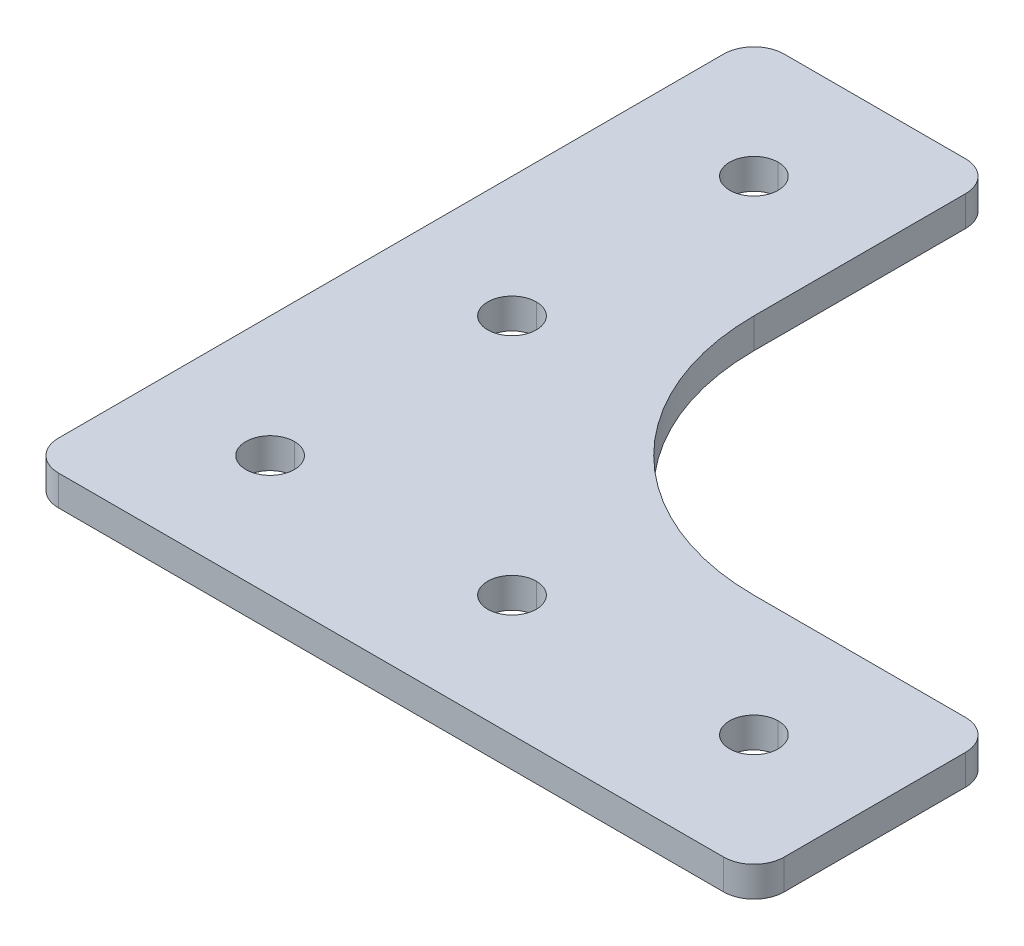
ISO-10303-21;
HEADER;
FILE_DESCRIPTION(('STEP AP214'),'2;1');
FILE_NAME('part.step','',(''),(''),'','','');
FILE_SCHEMA(('AUTOMOTIVE_DESIGN { 1 0 10303 214 1 1 1 1 }'));
ENDSEC;
DATA;
#1=APPLICATION_CONTEXT('core data for automotive mechanical design processes');
#2=APPLICATION_PROTOCOL_DEFINITION('international standard','automotive_design',2000,#1);
#3=PRODUCT_CONTEXT('',#1,'mechanical');
#4=PRODUCT('Part','Part','',(#3));
#5=PRODUCT_RELATED_PRODUCT_CATEGORY('part','',(#4));
#6=PRODUCT_DEFINITION_FORMATION('','',#4);
#7=PRODUCT_DEFINITION_CONTEXT('part definition',#1,'design');
#8=PRODUCT_DEFINITION('design','',#6,#7);
#9=PRODUCT_DEFINITION_SHAPE('','',#8);
#10=(LENGTH_UNIT() NAMED_UNIT(*) SI_UNIT(.MILLI.,.METRE.));
#11=(NAMED_UNIT(*) PLANE_ANGLE_UNIT() SI_UNIT($,.RADIAN.));
#12=(NAMED_UNIT(*) SI_UNIT($,.STERADIAN.) SOLID_ANGLE_UNIT());
#13=UNCERTAINTY_MEASURE_WITH_UNIT(LENGTH_MEASURE(1.E-05),#10,'distance_accuracy_value','');
#14=(GEOMETRIC_REPRESENTATION_CONTEXT(3) GLOBAL_UNCERTAINTY_ASSIGNED_CONTEXT((#13)) GLOBAL_UNIT_ASSIGNED_CONTEXT((#10,
#11,#12)) REPRESENTATION_CONTEXT('',''));
#15=CARTESIAN_POINT('',(0.,0.,0.));
#16=DIRECTION('',(0.,0.,1.));
#17=DIRECTION('',(1.,0.,0.));
#18=AXIS2_PLACEMENT_3D('',#15,#16,#17);
#19=CARTESIAN_POINT('',(3.175,3.175,-73.025));
#20=DIRECTION('',(0.,-1.,0.));
#21=DIRECTION('',(0.,0.,-1.));
#22=AXIS2_PLACEMENT_3D('',#19,#20,#21);
#23=CYLINDRICAL_SURFACE('',#22,3.175);
#24=CARTESIAN_POINT('',(3.175,3.175,-73.025));
#25=DIRECTION('',(0.,1.,0.));
#26=DIRECTION('',(0.,0.,-1.));
#27=AXIS2_PLACEMENT_3D('',#24,#25,#26);
#28=CIRCLE('',#27,3.175);
#29=CARTESIAN_POINT('',(3.175,3.175,-76.2));
#30=VERTEX_POINT('',#29);
#31=CARTESIAN_POINT('',(0.,3.175,-73.025));
#32=VERTEX_POINT('',#31);
#33=EDGE_CURVE('E410',#30,#32,#28,.T.);
#34=ORIENTED_EDGE('',*,*,#33,.F.);
#35=DIRECTION('',(0.,1.,0.));
#36=VECTOR('',#35,1.);
#37=CARTESIAN_POINT('',(3.175,3.175,-76.2));
#38=LINE('',#37,#36);
#39=CARTESIAN_POINT('',(3.175,0.,-76.2));
#40=VERTEX_POINT('',#39);
#41=EDGE_CURVE('E272',#40,#30,#38,.T.);
#42=ORIENTED_EDGE('',*,*,#41,.F.);
#43=CARTESIAN_POINT('',(3.175,0.,-73.025));
#44=DIRECTION('',(0.,-1.,0.));
#45=DIRECTION('',(0.,0.,-1.));
#46=AXIS2_PLACEMENT_3D('',#43,#44,#45);
#47=CIRCLE('',#46,3.175);
#48=CARTESIAN_POINT('',(0.,0.,-73.025));
#49=VERTEX_POINT('',#48);
#50=EDGE_CURVE('E42',#49,#40,#47,.T.);
#51=ORIENTED_EDGE('',*,*,#50,.F.);
#52=DIRECTION('',(0.,-1.,0.));
#53=VECTOR('',#52,1.);
#54=CARTESIAN_POINT('',(0.,3.175,-73.025));
#55=LINE('',#54,#53);
#56=EDGE_CURVE('E262',#32,#49,#55,.T.);
#57=ORIENTED_EDGE('',*,*,#56,.F.);
#58=EDGE_LOOP('',(#34,#42,#51,#57));
#59=FACE_BOUND('',#58,.T.);
#60=ADVANCED_FACE('F16',(#59),#23,.T.);
#61=CARTESIAN_POINT('',(22.225,3.175,-73.025));
#62=DIRECTION('',(0.,-1.,0.));
#63=DIRECTION('',(0.,0.,-1.));
#64=AXIS2_PLACEMENT_3D('',#61,#62,#63);
#65=CYLINDRICAL_SURFACE('',#64,3.175);
#66=CARTESIAN_POINT('',(22.225,3.175,-73.025));
#67=DIRECTION('',(0.,1.,0.));
#68=DIRECTION('',(0.,0.,-1.));
#69=AXIS2_PLACEMENT_3D('',#66,#67,#68);
#70=CIRCLE('',#69,3.175);
#71=CARTESIAN_POINT('',(25.4,3.175,-73.025));
#72=VERTEX_POINT('',#71);
#73=CARTESIAN_POINT('',(22.225,3.175,-76.2));
#74=VERTEX_POINT('',#73);
#75=EDGE_CURVE('E176',#72,#74,#70,.T.);
#76=ORIENTED_EDGE('',*,*,#75,.F.);
#77=DIRECTION('',(0.,1.,0.));
#78=VECTOR('',#77,1.);
#79=CARTESIAN_POINT('',(25.4,3.175,-73.025));
#80=LINE('',#79,#78);
#81=CARTESIAN_POINT('',(25.4,0.,-73.025));
#82=VERTEX_POINT('',#81);
#83=EDGE_CURVE('E351',#82,#72,#80,.T.);
#84=ORIENTED_EDGE('',*,*,#83,.F.);
#85=CARTESIAN_POINT('',(22.225,0.,-73.025));
#86=DIRECTION('',(0.,-1.,0.));
#87=DIRECTION('',(0.,0.,-1.));
#88=AXIS2_PLACEMENT_3D('',#85,#86,#87);
#89=CIRCLE('',#88,3.175);
#90=CARTESIAN_POINT('',(22.225,0.,-76.2));
#91=VERTEX_POINT('',#90);
#92=EDGE_CURVE('E359',#91,#82,#89,.T.);
#93=ORIENTED_EDGE('',*,*,#92,.F.);
#94=DIRECTION('',(0.,-1.,0.));
#95=VECTOR('',#94,1.);
#96=CARTESIAN_POINT('',(22.225,3.175,-76.2));
#97=LINE('',#96,#95);
#98=EDGE_CURVE('E273',#74,#91,#97,.T.);
#99=ORIENTED_EDGE('',*,*,#98,.F.);
#100=EDGE_LOOP('',(#76,#84,#93,#99));
#101=FACE_BOUND('',#100,.T.);
#102=ADVANCED_FACE('F507',(#101),#65,.T.);
#103=CARTESIAN_POINT('',(3.175,3.175,-3.175));
#104=DIRECTION('',(0.,-1.,0.));
#105=DIRECTION('',(0.,0.,-1.));
#106=AXIS2_PLACEMENT_3D('',#103,#104,#105);
#107=CYLINDRICAL_SURFACE('',#106,3.175);
#108=CARTESIAN_POINT('',(3.175,3.175,-3.175));
#109=DIRECTION('',(0.,1.,0.));
#110=DIRECTION('',(0.,0.,-1.));
#111=AXIS2_PLACEMENT_3D('',#108,#109,#110);
#112=CIRCLE('',#111,3.175);
#113=CARTESIAN_POINT('',(0.,3.175,-3.175));
#114=VERTEX_POINT('',#113);
#115=CARTESIAN_POINT('',(3.175,3.175,0.));
#116=VERTEX_POINT('',#115);
#117=EDGE_CURVE('E241',#114,#116,#112,.T.);
#118=ORIENTED_EDGE('',*,*,#117,.F.);
#119=DIRECTION('',(0.,1.,0.));
#120=VECTOR('',#119,1.);
#121=CARTESIAN_POINT('',(0.,3.175,-3.175));
#122=LINE('',#121,#120);
#123=CARTESIAN_POINT('',(0.,0.,-3.175));
#124=VERTEX_POINT('',#123);
#125=EDGE_CURVE('E295',#124,#114,#122,.T.);
#126=ORIENTED_EDGE('',*,*,#125,.F.);
#127=CARTESIAN_POINT('',(3.175,0.,-3.175));
#128=DIRECTION('',(0.,-1.,0.));
#129=DIRECTION('',(0.,0.,-1.));
#130=AXIS2_PLACEMENT_3D('',#127,#128,#129);
#131=CIRCLE('',#130,3.175);
#132=CARTESIAN_POINT('',(3.175,0.,0.));
#133=VERTEX_POINT('',#132);
#134=EDGE_CURVE('E415',#133,#124,#131,.T.);
#135=ORIENTED_EDGE('',*,*,#134,.F.);
#136=DIRECTION('',(0.,-1.,0.));
#137=VECTOR('',#136,1.);
#138=CARTESIAN_POINT('',(3.175,3.175,0.));
#139=LINE('',#138,#137);
#140=EDGE_CURVE('E251',#116,#133,#139,.T.);
#141=ORIENTED_EDGE('',*,*,#140,.F.);
#142=EDGE_LOOP('',(#118,#126,#135,#141));
#143=FACE_BOUND('',#142,.T.);
#144=ADVANCED_FACE('F513',(#143),#107,.T.);
#145=CARTESIAN_POINT('',(73.025,3.175,-3.175));
#146=DIRECTION('',(0.,-1.,0.));
#147=DIRECTION('',(0.,0.,-1.));
#148=AXIS2_PLACEMENT_3D('',#145,#146,#147);
#149=CYLINDRICAL_SURFACE('',#148,3.175);
#150=CARTESIAN_POINT('',(73.025,3.175,-3.175));
#151=DIRECTION('',(0.,1.,0.));
#152=DIRECTION('',(0.,0.,-1.));
#153=AXIS2_PLACEMENT_3D('',#150,#151,#152);
#154=CIRCLE('',#153,3.175);
#155=CARTESIAN_POINT('',(73.025,3.175,0.));
#156=VERTEX_POINT('',#155);
#157=CARTESIAN_POINT('',(76.2,3.175,-3.175));
#158=VERTEX_POINT('',#157);
#159=EDGE_CURVE('E147',#156,#158,#154,.T.);
#160=ORIENTED_EDGE('',*,*,#159,.F.);
#161=DIRECTION('',(0.,1.,0.));
#162=VECTOR('',#161,1.);
#163=CARTESIAN_POINT('',(73.025,3.175,0.));
#164=LINE('',#163,#162);
#165=CARTESIAN_POINT('',(73.025,0.,0.));
#166=VERTEX_POINT('',#165);
#167=EDGE_CURVE('E234',#166,#156,#164,.T.);
#168=ORIENTED_EDGE('',*,*,#167,.F.);
#169=CARTESIAN_POINT('',(73.025,0.,-3.175));
#170=DIRECTION('',(0.,-1.,0.));
#171=DIRECTION('',(0.,0.,-1.));
#172=AXIS2_PLACEMENT_3D('',#169,#170,#171);
#173=CIRCLE('',#172,3.175);
#174=CARTESIAN_POINT('',(76.2,0.,-3.175));
#175=VERTEX_POINT('',#174);
#176=EDGE_CURVE('E371',#175,#166,#173,.T.);
#177=ORIENTED_EDGE('',*,*,#176,.F.);
#178=DIRECTION('',(0.,-1.,0.));
#179=VECTOR('',#178,1.);
#180=CARTESIAN_POINT('',(76.2,3.175,-3.175));
#181=LINE('',#180,#179);
#182=EDGE_CURVE('E237',#158,#175,#181,.T.);
#183=ORIENTED_EDGE('',*,*,#182,.F.);
#184=EDGE_LOOP('',(#160,#168,#177,#183));
#185=FACE_BOUND('',#184,.T.);
#186=ADVANCED_FACE('F232',(#185),#149,.T.);
#187=CARTESIAN_POINT('',(73.025,3.175,-22.225));
#188=DIRECTION('',(0.,-1.,0.));
#189=DIRECTION('',(0.,0.,-1.));
#190=AXIS2_PLACEMENT_3D('',#187,#188,#189);
#191=CYLINDRICAL_SURFACE('',#190,3.175);
#192=CARTESIAN_POINT('',(73.025,3.175,-22.225));
#193=DIRECTION('',(0.,1.,0.));
#194=DIRECTION('',(0.,0.,-1.));
#195=AXIS2_PLACEMENT_3D('',#192,#193,#194);
#196=CIRCLE('',#195,3.175);
#197=CARTESIAN_POINT('',(76.2,3.175,-22.225));
#198=VERTEX_POINT('',#197);
#199=CARTESIAN_POINT('',(73.025,3.175,-25.4));
#200=VERTEX_POINT('',#199);
#201=EDGE_CURVE('E159',#198,#200,#196,.T.);
#202=ORIENTED_EDGE('',*,*,#201,.F.);
#203=DIRECTION('',(0.,1.,0.));
#204=VECTOR('',#203,1.);
#205=CARTESIAN_POINT('',(76.2,3.175,-22.225));
#206=LINE('',#205,#204);
#207=CARTESIAN_POINT('',(76.2,0.,-22.225));
#208=VERTEX_POINT('',#207);
#209=EDGE_CURVE('E316',#208,#198,#206,.T.);
#210=ORIENTED_EDGE('',*,*,#209,.F.);
#211=CARTESIAN_POINT('',(73.025,0.,-22.225));
#212=DIRECTION('',(0.,-1.,0.));
#213=DIRECTION('',(0.,0.,-1.));
#214=AXIS2_PLACEMENT_3D('',#211,#212,#213);
#215=CIRCLE('',#214,3.175);
#216=CARTESIAN_POINT('',(73.025,0.,-25.4));
#217=VERTEX_POINT('',#216);
#218=EDGE_CURVE('E368',#217,#208,#215,.T.);
#219=ORIENTED_EDGE('',*,*,#218,.F.);
#220=DIRECTION('',(0.,-1.,0.));
#221=VECTOR('',#220,1.);
#222=CARTESIAN_POINT('',(73.025,3.175,-25.4));
#223=LINE('',#222,#221);
#224=EDGE_CURVE('E278',#200,#217,#223,.T.);
#225=ORIENTED_EDGE('',*,*,#224,.F.);
#226=EDGE_LOOP('',(#202,#210,#219,#225));
#227=FACE_BOUND('',#226,.T.);
#228=ADVANCED_FACE('F540',(#227),#191,.T.);
#229=CARTESIAN_POINT('',(12.7,0.,-63.5));
#230=DIRECTION('',(0.,1.,0.));
#231=DIRECTION('',(0.,0.,1.));
#232=AXIS2_PLACEMENT_3D('',#229,#230,#231);
#233=CYLINDRICAL_SURFACE('',#232,2.5527);
#234=DIRECTION('',(0.,1.,0.));
#235=VECTOR('',#234,1.);
#236=CARTESIAN_POINT('',(12.7,0.,-66.0527));
#237=LINE('',#236,#235);
#238=CARTESIAN_POINT('',(12.7,0.,-66.0527));
#239=VERTEX_POINT('',#238);
#240=CARTESIAN_POINT('',(12.7,3.175,-66.0527));
#241=VERTEX_POINT('',#240);
#242=EDGE_CURVE('E310',#239,#241,#237,.T.);
#243=ORIENTED_EDGE('',*,*,#242,.F.);
#244=CARTESIAN_POINT('',(12.7,0.,-63.5));
#245=DIRECTION('',(0.,1.,0.));
#246=DIRECTION('',(0.,0.,1.));
#247=AXIS2_PLACEMENT_3D('',#244,#245,#246);
#248=CIRCLE('',#247,2.5527);
#249=CARTESIAN_POINT('',(12.7,0.,-60.9473));
#250=VERTEX_POINT('',#249);
#251=EDGE_CURVE('E20',#250,#239,#248,.T.);
#252=ORIENTED_EDGE('',*,*,#251,.F.);
#253=DIRECTION('',(0.,1.,0.));
#254=VECTOR('',#253,1.);
#255=CARTESIAN_POINT('',(12.7,0.,-60.9473));
#256=LINE('',#255,#254);
#257=CARTESIAN_POINT('',(12.7,3.175,-60.9473));
#258=VERTEX_POINT('',#257);
#259=EDGE_CURVE('E320',#250,#258,#256,.T.);
#260=ORIENTED_EDGE('',*,*,#259,.T.);
#261=CARTESIAN_POINT('',(12.7,3.175,-63.5));
#262=DIRECTION('',(0.,1.,0.));
#263=DIRECTION('',(0.,0.,1.));
#264=AXIS2_PLACEMENT_3D('',#261,#262,#263);
#265=CIRCLE('',#264,2.5527);
#266=EDGE_CURVE('E240',#258,#241,#265,.T.);
#267=ORIENTED_EDGE('',*,*,#266,.T.);
#268=EDGE_LOOP('',(#243,#252,#260,#267));
#269=FACE_BOUND('',#268,.T.);
#270=ADVANCED_FACE('F483',(#269),#233,.F.);
#271=CARTESIAN_POINT('',(12.7,0.,-38.1));
#272=DIRECTION('',(0.,1.,0.));
#273=DIRECTION('',(0.,0.,1.));
#274=AXIS2_PLACEMENT_3D('',#271,#272,#273);
#275=CYLINDRICAL_SURFACE('',#274,2.5527);
#276=DIRECTION('',(0.,1.,0.));
#277=VECTOR('',#276,1.);
#278=CARTESIAN_POINT('',(12.7,0.,-40.6527));
#279=LINE('',#278,#277);
#280=CARTESIAN_POINT('',(12.7,0.,-40.6527));
#281=VERTEX_POINT('',#280);
#282=CARTESIAN_POINT('',(12.7,3.175,-40.6527));
#283=VERTEX_POINT('',#282);
#284=EDGE_CURVE('E296',#281,#283,#279,.T.);
#285=ORIENTED_EDGE('',*,*,#284,.F.);
#286=CARTESIAN_POINT('',(12.7,0.,-38.1));
#287=DIRECTION('',(0.,1.,0.));
#288=DIRECTION('',(0.,0.,1.));
#289=AXIS2_PLACEMENT_3D('',#286,#287,#288);
#290=CIRCLE('',#289,2.5527);
#291=CARTESIAN_POINT('',(12.7,0.,-35.5473));
#292=VERTEX_POINT('',#291);
#293=EDGE_CURVE('E305',#292,#281,#290,.T.);
#294=ORIENTED_EDGE('',*,*,#293,.F.);
#295=DIRECTION('',(0.,1.,0.));
#296=VECTOR('',#295,1.);
#297=CARTESIAN_POINT('',(12.7,0.,-35.5473));
#298=LINE('',#297,#296);
#299=CARTESIAN_POINT('',(12.7,3.175,-35.5473));
#300=VERTEX_POINT('',#299);
#301=EDGE_CURVE('E338',#292,#300,#298,.T.);
#302=ORIENTED_EDGE('',*,*,#301,.T.);
#303=CARTESIAN_POINT('',(12.7,3.175,-38.1));
#304=DIRECTION('',(0.,1.,0.));
#305=DIRECTION('',(0.,0.,1.));
#306=AXIS2_PLACEMENT_3D('',#303,#304,#305);
#307=CIRCLE('',#306,2.5527);
#308=EDGE_CURVE('E427',#300,#283,#307,.T.);
#309=ORIENTED_EDGE('',*,*,#308,.T.);
#310=EDGE_LOOP('',(#285,#294,#302,#309));
#311=FACE_BOUND('',#310,.T.);
#312=ADVANCED_FACE('F566',(#311),#275,.F.);
#313=CARTESIAN_POINT('',(12.7,0.,-12.7));
#314=DIRECTION('',(0.,1.,0.));
#315=DIRECTION('',(0.,0.,1.));
#316=AXIS2_PLACEMENT_3D('',#313,#314,#315);
#317=CYLINDRICAL_SURFACE('',#316,2.5527);
#318=DIRECTION('',(0.,1.,0.));
#319=VECTOR('',#318,1.);
#320=CARTESIAN_POINT('',(12.7,0.,-15.2527));
#321=LINE('',#320,#319);
#322=CARTESIAN_POINT('',(12.7,0.,-15.2527));
#323=VERTEX_POINT('',#322);
#324=CARTESIAN_POINT('',(12.7,3.175,-15.2527));
#325=VERTEX_POINT('',#324);
#326=EDGE_CURVE('E437',#323,#325,#321,.T.);
#327=ORIENTED_EDGE('',*,*,#326,.F.);
#328=CARTESIAN_POINT('',(12.7,0.,-12.7));
#329=DIRECTION('',(0.,1.,0.));
#330=DIRECTION('',(0.,0.,1.));
#331=AXIS2_PLACEMENT_3D('',#328,#329,#330);
#332=CIRCLE('',#331,2.5527);
#333=CARTESIAN_POINT('',(12.7,0.,-10.1473));
#334=VERTEX_POINT('',#333);
#335=EDGE_CURVE('E302',#334,#323,#332,.T.);
#336=ORIENTED_EDGE('',*,*,#335,.F.);
#337=DIRECTION('',(0.,1.,0.));
#338=VECTOR('',#337,1.);
#339=CARTESIAN_POINT('',(12.7,0.,-10.1473));
#340=LINE('',#339,#338);
#341=CARTESIAN_POINT('',(12.7,3.175,-10.1473));
#342=VERTEX_POINT('',#341);
#343=EDGE_CURVE('E279',#334,#342,#340,.T.);
#344=ORIENTED_EDGE('',*,*,#343,.T.);
#345=CARTESIAN_POINT('',(12.7,3.175,-12.7));
#346=DIRECTION('',(0.,1.,0.));
#347=DIRECTION('',(0.,0.,1.));
#348=AXIS2_PLACEMENT_3D('',#345,#346,#347);
#349=CIRCLE('',#348,2.5527);
#350=EDGE_CURVE('E376',#342,#325,#349,.T.);
#351=ORIENTED_EDGE('',*,*,#350,.T.);
#352=EDGE_LOOP('',(#327,#336,#344,#351));
#353=FACE_BOUND('',#352,.T.);
#354=ADVANCED_FACE('F570',(#353),#317,.F.);
#355=CARTESIAN_POINT('',(38.1,0.,-12.7));
#356=DIRECTION('',(0.,1.,0.));
#357=DIRECTION('',(0.,0.,1.));
#358=AXIS2_PLACEMENT_3D('',#355,#356,#357);
#359=CYLINDRICAL_SURFACE('',#358,2.5527);
#360=DIRECTION('',(0.,1.,0.));
#361=VECTOR('',#360,1.);
#362=CARTESIAN_POINT('',(38.1,0.,-15.2527));
#363=LINE('',#362,#361);
#364=CARTESIAN_POINT('',(38.1,0.,-15.2527));
#365=VERTEX_POINT('',#364);
#366=CARTESIAN_POINT('',(38.1,3.175,-15.2527));
#367=VERTEX_POINT('',#366);
#368=EDGE_CURVE('E339',#365,#367,#363,.T.);
#369=ORIENTED_EDGE('',*,*,#368,.F.);
#370=CARTESIAN_POINT('',(38.1,0.,-12.7));
#371=DIRECTION('',(0.,1.,0.));
#372=DIRECTION('',(0.,0.,1.));
#373=AXIS2_PLACEMENT_3D('',#370,#371,#372);
#374=CIRCLE('',#373,2.5527);
#375=CARTESIAN_POINT('',(38.1,0.,-10.1473));
#376=VERTEX_POINT('',#375);
#377=EDGE_CURVE('E27',#376,#365,#374,.T.);
#378=ORIENTED_EDGE('',*,*,#377,.F.);
#379=DIRECTION('',(0.,1.,0.));
#380=VECTOR('',#379,1.);
#381=CARTESIAN_POINT('',(38.1,0.,-10.1473));
#382=LINE('',#381,#380);
#383=CARTESIAN_POINT('',(38.1,3.175,-10.1473));
#384=VERTEX_POINT('',#383);
#385=EDGE_CURVE('E377',#376,#384,#382,.T.);
#386=ORIENTED_EDGE('',*,*,#385,.T.);
#387=CARTESIAN_POINT('',(38.1,3.175,-12.7));
#388=DIRECTION('',(0.,1.,0.));
#389=DIRECTION('',(0.,0.,1.));
#390=AXIS2_PLACEMENT_3D('',#387,#388,#389);
#391=CIRCLE('',#390,2.5527);
#392=EDGE_CURVE('E373',#384,#367,#391,.T.);
#393=ORIENTED_EDGE('',*,*,#392,.T.);
#394=EDGE_LOOP('',(#369,#378,#386,#393));
#395=FACE_BOUND('',#394,.T.);
#396=ADVANCED_FACE('F576',(#395),#359,.F.);
#397=CARTESIAN_POINT('',(63.5,0.,-12.7));
#398=DIRECTION('',(0.,1.,0.));
#399=DIRECTION('',(0.,0.,1.));
#400=AXIS2_PLACEMENT_3D('',#397,#398,#399);
#401=CYLINDRICAL_SURFACE('',#400,2.5527);
#402=DIRECTION('',(0.,1.,0.));
#403=VECTOR('',#402,1.);
#404=CARTESIAN_POINT('',(63.5,0.,-15.2527));
#405=LINE('',#404,#403);
#406=CARTESIAN_POINT('',(63.5,0.,-15.2527));
#407=VERTEX_POINT('',#406);
#408=CARTESIAN_POINT('',(63.5,3.175,-15.2527));
#409=VERTEX_POINT('',#408);
#410=EDGE_CURVE('E290',#407,#409,#405,.T.);
#411=ORIENTED_EDGE('',*,*,#410,.F.);
#412=CARTESIAN_POINT('',(63.5,0.,-12.7));
#413=DIRECTION('',(0.,1.,0.));
#414=DIRECTION('',(0.,0.,1.));
#415=AXIS2_PLACEMENT_3D('',#412,#413,#414);
#416=CIRCLE('',#415,2.5527);
#417=CARTESIAN_POINT('',(63.5,0.,-10.1473));
#418=VERTEX_POINT('',#417);
#419=EDGE_CURVE('E10',#418,#407,#416,.T.);
#420=ORIENTED_EDGE('',*,*,#419,.F.);
#421=DIRECTION('',(0.,1.,0.));
#422=VECTOR('',#421,1.);
#423=CARTESIAN_POINT('',(63.5,0.,-10.1473));
#424=LINE('',#423,#422);
#425=CARTESIAN_POINT('',(63.5,3.175,-10.1473));
#426=VERTEX_POINT('',#425);
#427=EDGE_CURVE('E289',#418,#426,#424,.T.);
#428=ORIENTED_EDGE('',*,*,#427,.T.);
#429=CARTESIAN_POINT('',(63.5,3.175,-12.7));
#430=DIRECTION('',(0.,1.,0.));
#431=DIRECTION('',(0.,0.,1.));
#432=AXIS2_PLACEMENT_3D('',#429,#430,#431);
#433=CIRCLE('',#432,2.5527);
#434=EDGE_CURVE('E372',#426,#409,#433,.T.);
#435=ORIENTED_EDGE('',*,*,#434,.T.);
#436=EDGE_LOOP('',(#411,#420,#428,#435));
#437=FACE_BOUND('',#436,.T.);
#438=ADVANCED_FACE('F501',(#437),#401,.F.);
#439=CARTESIAN_POINT('',(50.8,0.,-50.8));
#440=DIRECTION('',(0.,-1.,0.));
#441=DIRECTION('',(0.,0.,-1.));
#442=AXIS2_PLACEMENT_3D('',#439,#440,#441);
#443=PLANE('',#442);
#444=ORIENTED_EDGE('',*,*,#419,.T.);
#445=CARTESIAN_POINT('',(63.5,0.,-12.7));
#446=DIRECTION('',(0.,1.,0.));
#447=DIRECTION('',(0.,0.,1.));
#448=AXIS2_PLACEMENT_3D('',#445,#446,#447);
#449=CIRCLE('',#448,2.5527);
#450=EDGE_CURVE('E346',#407,#418,#449,.T.);
#451=ORIENTED_EDGE('',*,*,#450,.T.);
#452=EDGE_LOOP('',(#444,#451));
#453=FACE_BOUND('',#452,.T.);
#454=ORIENTED_EDGE('',*,*,#377,.T.);
#455=CARTESIAN_POINT('',(38.1,0.,-12.7));
#456=DIRECTION('',(0.,1.,0.));
#457=DIRECTION('',(0.,0.,1.));
#458=AXIS2_PLACEMENT_3D('',#455,#456,#457);
#459=CIRCLE('',#458,2.5527);
#460=EDGE_CURVE('E283',#365,#376,#459,.T.);
#461=ORIENTED_EDGE('',*,*,#460,.T.);
#462=EDGE_LOOP('',(#454,#461));
#463=FACE_BOUND('',#462,.T.);
#464=ORIENTED_EDGE('',*,*,#335,.T.);
#465=CARTESIAN_POINT('',(12.7,0.,-12.7));
#466=DIRECTION('',(0.,1.,0.));
#467=DIRECTION('',(0.,0.,1.));
#468=AXIS2_PLACEMENT_3D('',#465,#466,#467);
#469=CIRCLE('',#468,2.5527);
#470=EDGE_CURVE('E441',#323,#334,#469,.T.);
#471=ORIENTED_EDGE('',*,*,#470,.T.);
#472=EDGE_LOOP('',(#464,#471));
#473=FACE_BOUND('',#472,.T.);
#474=ORIENTED_EDGE('',*,*,#293,.T.);
#475=CARTESIAN_POINT('',(12.7,0.,-38.1));
#476=DIRECTION('',(0.,1.,0.));
#477=DIRECTION('',(0.,0.,1.));
#478=AXIS2_PLACEMENT_3D('',#475,#476,#477);
#479=CIRCLE('',#478,2.5527);
#480=EDGE_CURVE('E301',#281,#292,#479,.T.);
#481=ORIENTED_EDGE('',*,*,#480,.T.);
#482=EDGE_LOOP('',(#474,#481));
#483=FACE_BOUND('',#482,.T.);
#484=ORIENTED_EDGE('',*,*,#251,.T.);
#485=CARTESIAN_POINT('',(12.7,0.,-63.5));
#486=DIRECTION('',(0.,1.,0.));
#487=DIRECTION('',(0.,0.,1.));
#488=AXIS2_PLACEMENT_3D('',#485,#486,#487);
#489=CIRCLE('',#488,2.5527);
#490=EDGE_CURVE('E306',#239,#250,#489,.T.);
#491=ORIENTED_EDGE('',*,*,#490,.T.);
#492=EDGE_LOOP('',(#484,#491));
#493=FACE_BOUND('',#492,.T.);
#494=DIRECTION('',(-1.,0.,0.));
#495=VECTOR('',#494,1.);
#496=CARTESIAN_POINT('',(76.2,0.,-25.4));
#497=LINE('',#496,#495);
#498=CARTESIAN_POINT('',(50.8,0.,-25.4));
#499=VERTEX_POINT('',#498);
#500=EDGE_CURVE('E355',#217,#499,#497,.T.);
#501=ORIENTED_EDGE('',*,*,#500,.F.);
#502=ORIENTED_EDGE('',*,*,#218,.T.);
#503=DIRECTION('',(0.,0.,-1.));
#504=VECTOR('',#503,1.);
#505=CARTESIAN_POINT('',(76.2,0.,0.));
#506=LINE('',#505,#504);
#507=EDGE_CURVE('E381',#175,#208,#506,.T.);
#508=ORIENTED_EDGE('',*,*,#507,.F.);
#509=ORIENTED_EDGE('',*,*,#176,.T.);
#510=DIRECTION('',(1.,0.,0.));
#511=VECTOR('',#510,1.);
#512=CARTESIAN_POINT('',(0.,0.,0.));
#513=LINE('',#512,#511);
#514=EDGE_CURVE('E255',#133,#166,#513,.T.);
#515=ORIENTED_EDGE('',*,*,#514,.F.);
#516=ORIENTED_EDGE('',*,*,#134,.T.);
#517=DIRECTION('',(0.,0.,1.));
#518=VECTOR('',#517,1.);
#519=CARTESIAN_POINT('',(0.,0.,-76.2));
#520=LINE('',#519,#518);
#521=EDGE_CURVE('E291',#49,#124,#520,.T.);
#522=ORIENTED_EDGE('',*,*,#521,.F.);
#523=ORIENTED_EDGE('',*,*,#50,.T.);
#524=DIRECTION('',(-1.,0.,0.));
#525=VECTOR('',#524,1.);
#526=CARTESIAN_POINT('',(25.4,0.,-76.2));
#527=LINE('',#526,#525);
#528=EDGE_CURVE('E268',#91,#40,#527,.T.);
#529=ORIENTED_EDGE('',*,*,#528,.F.);
#530=ORIENTED_EDGE('',*,*,#92,.T.);
#531=DIRECTION('',(0.,0.,-1.));
#532=VECTOR('',#531,1.);
#533=CARTESIAN_POINT('',(25.4,0.,-50.8));
#534=LINE('',#533,#532);
#535=CARTESIAN_POINT('',(25.4,0.,-50.8));
#536=VERTEX_POINT('',#535);
#537=EDGE_CURVE('E333',#536,#82,#534,.T.);
#538=ORIENTED_EDGE('',*,*,#537,.F.);
#539=CARTESIAN_POINT('',(50.8,0.,-50.8));
#540=DIRECTION('',(0.,-1.,0.));
#541=DIRECTION('',(0.,0.,-1.));
#542=AXIS2_PLACEMENT_3D('',#539,#540,#541);
#543=CIRCLE('',#542,25.4);
#544=EDGE_CURVE('E324',#499,#536,#543,.T.);
#545=ORIENTED_EDGE('',*,*,#544,.F.);
#546=EDGE_LOOP('',(#501,#502,#508,#509,#515,#516,#522,#523,#529,#530,#538,#545));
#547=FACE_BOUND('',#546,.T.);
#548=ADVANCED_FACE('F490',(#453,#463,#473,#483,#493,#547),#443,.T.);
#549=CARTESIAN_POINT('',(50.8,3.175,-50.8));
#550=DIRECTION('',(0.,-1.,0.));
#551=DIRECTION('',(0.,0.,-1.));
#552=AXIS2_PLACEMENT_3D('',#549,#550,#551);
#553=PLANE('',#552);
#554=ORIENTED_EDGE('',*,*,#434,.F.);
#555=CARTESIAN_POINT('',(63.5,3.175,-12.7));
#556=DIRECTION('',(0.,1.,0.));
#557=DIRECTION('',(0.,0.,1.));
#558=AXIS2_PLACEMENT_3D('',#555,#556,#557);
#559=CIRCLE('',#558,2.5527);
#560=EDGE_CURVE('E285',#409,#426,#559,.T.);
#561=ORIENTED_EDGE('',*,*,#560,.F.);
#562=EDGE_LOOP('',(#554,#561));
#563=FACE_BOUND('',#562,.T.);
#564=ORIENTED_EDGE('',*,*,#392,.F.);
#565=CARTESIAN_POINT('',(38.1,3.175,-12.7));
#566=DIRECTION('',(0.,1.,0.));
#567=DIRECTION('',(0.,0.,1.));
#568=AXIS2_PLACEMENT_3D('',#565,#566,#567);
#569=CIRCLE('',#568,2.5527);
#570=EDGE_CURVE('E266',#367,#384,#569,.T.);
#571=ORIENTED_EDGE('',*,*,#570,.F.);
#572=EDGE_LOOP('',(#564,#571));
#573=FACE_BOUND('',#572,.T.);
#574=ORIENTED_EDGE('',*,*,#350,.F.);
#575=CARTESIAN_POINT('',(12.7,3.175,-12.7));
#576=DIRECTION('',(0.,1.,0.));
#577=DIRECTION('',(0.,0.,1.));
#578=AXIS2_PLACEMENT_3D('',#575,#576,#577);
#579=CIRCLE('',#578,2.5527);
#580=EDGE_CURVE('E284',#325,#342,#579,.T.);
#581=ORIENTED_EDGE('',*,*,#580,.F.);
#582=EDGE_LOOP('',(#574,#581));
#583=FACE_BOUND('',#582,.T.);
#584=ORIENTED_EDGE('',*,*,#308,.F.);
#585=CARTESIAN_POINT('',(12.7,3.175,-38.1));
#586=DIRECTION('',(0.,1.,0.));
#587=DIRECTION('',(0.,0.,1.));
#588=AXIS2_PLACEMENT_3D('',#585,#586,#587);
#589=CIRCLE('',#588,2.5527);
#590=EDGE_CURVE('E300',#283,#300,#589,.T.);
#591=ORIENTED_EDGE('',*,*,#590,.F.);
#592=EDGE_LOOP('',(#584,#591));
#593=FACE_BOUND('',#592,.T.);
#594=ORIENTED_EDGE('',*,*,#266,.F.);
#595=CARTESIAN_POINT('',(12.7,3.175,-63.5));
#596=DIRECTION('',(0.,1.,0.));
#597=DIRECTION('',(0.,0.,1.));
#598=AXIS2_PLACEMENT_3D('',#595,#596,#597);
#599=CIRCLE('',#598,2.5527);
#600=EDGE_CURVE('E365',#241,#258,#599,.T.);
#601=ORIENTED_EDGE('',*,*,#600,.F.);
#602=EDGE_LOOP('',(#594,#601));
#603=FACE_BOUND('',#602,.T.);
#604=DIRECTION('',(0.,0.,-1.));
#605=VECTOR('',#604,1.);
#606=CARTESIAN_POINT('',(76.2,3.175,0.));
#607=LINE('',#606,#605);
#608=EDGE_CURVE('E313',#158,#198,#607,.T.);
#609=ORIENTED_EDGE('',*,*,#608,.T.);
#610=ORIENTED_EDGE('',*,*,#201,.T.);
#611=DIRECTION('',(-1.,0.,0.));
#612=VECTOR('',#611,1.);
#613=CARTESIAN_POINT('',(76.2,3.175,-25.4));
#614=LINE('',#613,#612);
#615=CARTESIAN_POINT('',(50.8,3.175,-25.4));
#616=VERTEX_POINT('',#615);
#617=EDGE_CURVE('E274',#200,#616,#614,.T.);
#618=ORIENTED_EDGE('',*,*,#617,.T.);
#619=CARTESIAN_POINT('',(50.8,3.175,-50.8));
#620=DIRECTION('',(0.,-1.,0.));
#621=DIRECTION('',(0.,0.,-1.));
#622=AXIS2_PLACEMENT_3D('',#619,#620,#621);
#623=CIRCLE('',#622,25.4);
#624=CARTESIAN_POINT('',(25.4,3.175,-50.8));
#625=VERTEX_POINT('',#624);
#626=EDGE_CURVE('E330',#616,#625,#623,.T.);
#627=ORIENTED_EDGE('',*,*,#626,.T.);
#628=DIRECTION('',(0.,0.,-1.));
#629=VECTOR('',#628,1.);
#630=CARTESIAN_POINT('',(25.4,3.175,-50.8));
#631=LINE('',#630,#629);
#632=EDGE_CURVE('E347',#625,#72,#631,.T.);
#633=ORIENTED_EDGE('',*,*,#632,.T.);
#634=ORIENTED_EDGE('',*,*,#75,.T.);
#635=DIRECTION('',(-1.,0.,0.));
#636=VECTOR('',#635,1.);
#637=CARTESIAN_POINT('',(25.4,3.175,-76.2));
#638=LINE('',#637,#636);
#639=EDGE_CURVE('E350',#74,#30,#638,.T.);
#640=ORIENTED_EDGE('',*,*,#639,.T.);
#641=ORIENTED_EDGE('',*,*,#33,.T.);
#642=DIRECTION('',(0.,0.,1.));
#643=VECTOR('',#642,1.);
#644=CARTESIAN_POINT('',(0.,3.175,-76.2));
#645=LINE('',#644,#643);
#646=EDGE_CURVE('E393',#32,#114,#645,.T.);
#647=ORIENTED_EDGE('',*,*,#646,.T.);
#648=ORIENTED_EDGE('',*,*,#117,.T.);
#649=DIRECTION('',(1.,0.,0.));
#650=VECTOR('',#649,1.);
#651=CARTESIAN_POINT('',(0.,3.175,0.));
#652=LINE('',#651,#650);
#653=EDGE_CURVE('E244',#116,#156,#652,.T.);
#654=ORIENTED_EDGE('',*,*,#653,.T.);
#655=ORIENTED_EDGE('',*,*,#159,.T.);
#656=EDGE_LOOP('',(#609,#610,#618,#627,#633,#634,#640,#641,#647,#648,#654,#655));
#657=FACE_BOUND('',#656,.T.);
#658=ADVANCED_FACE('F245',(#563,#573,#583,#593,#603,#657),#553,.F.);
#659=CARTESIAN_POINT('',(25.4,3.175,-76.2));
#660=DIRECTION('',(0.,0.,1.));
#661=DIRECTION('',(1.,0.,0.));
#662=AXIS2_PLACEMENT_3D('',#659,#660,#661);
#663=PLANE('',#662);
#664=ORIENTED_EDGE('',*,*,#639,.F.);
#665=ORIENTED_EDGE('',*,*,#98,.T.);
#666=ORIENTED_EDGE('',*,*,#528,.T.);
#667=ORIENTED_EDGE('',*,*,#41,.T.);
#668=EDGE_LOOP('',(#664,#665,#666,#667));
#669=FACE_BOUND('',#668,.T.);
#670=ADVANCED_FACE('F489',(#669),#663,.F.);
#671=CARTESIAN_POINT('',(25.4,3.175,-50.8));
#672=DIRECTION('',(-1.,0.,0.));
#673=DIRECTION('',(0.,0.,1.));
#674=AXIS2_PLACEMENT_3D('',#671,#672,#673);
#675=PLANE('',#674);
#676=ORIENTED_EDGE('',*,*,#537,.T.);
#677=ORIENTED_EDGE('',*,*,#83,.T.);
#678=ORIENTED_EDGE('',*,*,#632,.F.);
#679=DIRECTION('',(0.,-1.,0.));
#680=VECTOR('',#679,1.);
#681=CARTESIAN_POINT('',(25.4,3.175,-50.8));
#682=LINE('',#681,#680);
#683=EDGE_CURVE('E328',#625,#536,#682,.T.);
#684=ORIENTED_EDGE('',*,*,#683,.T.);
#685=EDGE_LOOP('',(#676,#677,#678,#684));
#686=FACE_BOUND('',#685,.T.);
#687=ADVANCED_FACE('F498',(#686),#675,.F.);
#688=CARTESIAN_POINT('',(50.8,3.175,-50.8));
#689=DIRECTION('',(0.,-1.,0.));
#690=DIRECTION('',(0.,0.,-1.));
#691=AXIS2_PLACEMENT_3D('',#688,#689,#690);
#692=CYLINDRICAL_SURFACE('',#691,25.4);
#693=ORIENTED_EDGE('',*,*,#544,.T.);
#694=ORIENTED_EDGE('',*,*,#683,.F.);
#695=ORIENTED_EDGE('',*,*,#626,.F.);
#696=DIRECTION('',(0.,-1.,0.));
#697=VECTOR('',#696,1.);
#698=CARTESIAN_POINT('',(50.8,3.175,-25.4));
#699=LINE('',#698,#697);
#700=EDGE_CURVE('E329',#616,#499,#699,.T.);
#701=ORIENTED_EDGE('',*,*,#700,.T.);
#702=EDGE_LOOP('',(#693,#694,#695,#701));
#703=FACE_BOUND('',#702,.T.);
#704=ADVANCED_FACE('F521',(#703),#692,.F.);
#705=CARTESIAN_POINT('',(76.2,3.175,-25.4));
#706=DIRECTION('',(0.,0.,1.));
#707=DIRECTION('',(1.,0.,0.));
#708=AXIS2_PLACEMENT_3D('',#705,#706,#707);
#709=PLANE('',#708);
#710=ORIENTED_EDGE('',*,*,#617,.F.);
#711=ORIENTED_EDGE('',*,*,#224,.T.);
#712=ORIENTED_EDGE('',*,*,#500,.T.);
#713=ORIENTED_EDGE('',*,*,#700,.F.);
#714=EDGE_LOOP('',(#710,#711,#712,#713));
#715=FACE_BOUND('',#714,.T.);
#716=ADVANCED_FACE('F523',(#715),#709,.F.);
#717=CARTESIAN_POINT('',(76.2,3.175,0.));
#718=DIRECTION('',(-1.,0.,0.));
#719=DIRECTION('',(0.,0.,1.));
#720=AXIS2_PLACEMENT_3D('',#717,#718,#719);
#721=PLANE('',#720);
#722=ORIENTED_EDGE('',*,*,#507,.T.);
#723=ORIENTED_EDGE('',*,*,#209,.T.);
#724=ORIENTED_EDGE('',*,*,#608,.F.);
#725=ORIENTED_EDGE('',*,*,#182,.T.);
#726=EDGE_LOOP('',(#722,#723,#724,#725));
#727=FACE_BOUND('',#726,.T.);
#728=ADVANCED_FACE('F529',(#727),#721,.F.);
#729=CARTESIAN_POINT('',(0.,3.175,0.));
#730=DIRECTION('',(0.,0.,-1.));
#731=DIRECTION('',(0.,-1.,0.));
#732=AXIS2_PLACEMENT_3D('',#729,#730,#731);
#733=PLANE('',#732);
#734=ORIENTED_EDGE('',*,*,#514,.T.);
#735=ORIENTED_EDGE('',*,*,#167,.T.);
#736=ORIENTED_EDGE('',*,*,#653,.F.);
#737=ORIENTED_EDGE('',*,*,#140,.T.);
#738=EDGE_LOOP('',(#734,#735,#736,#737));
#739=FACE_BOUND('',#738,.T.);
#740=ADVANCED_FACE('F253',(#739),#733,.F.);
#741=CARTESIAN_POINT('',(0.,3.175,-76.2));
#742=DIRECTION('',(1.,0.,0.));
#743=DIRECTION('',(0.,1.,0.));
#744=AXIS2_PLACEMENT_3D('',#741,#742,#743);
#745=PLANE('',#744);
#746=ORIENTED_EDGE('',*,*,#521,.T.);
#747=ORIENTED_EDGE('',*,*,#125,.T.);
#748=ORIENTED_EDGE('',*,*,#646,.F.);
#749=ORIENTED_EDGE('',*,*,#56,.T.);
#750=EDGE_LOOP('',(#746,#747,#748,#749));
#751=FACE_BOUND('',#750,.T.);
#752=ADVANCED_FACE('F517',(#751),#745,.F.);
#753=CARTESIAN_POINT('',(63.5,0.,-12.7));
#754=DIRECTION('',(0.,1.,0.));
#755=DIRECTION('',(0.,0.,1.));
#756=AXIS2_PLACEMENT_3D('',#753,#754,#755);
#757=CYLINDRICAL_SURFACE('',#756,2.5527);
#758=ORIENTED_EDGE('',*,*,#450,.F.);
#759=ORIENTED_EDGE('',*,*,#410,.T.);
#760=ORIENTED_EDGE('',*,*,#560,.T.);
#761=ORIENTED_EDGE('',*,*,#427,.F.);
#762=EDGE_LOOP('',(#758,#759,#760,#761));
#763=FACE_BOUND('',#762,.T.);
#764=ADVANCED_FACE('F519',(#763),#757,.F.);
#765=CARTESIAN_POINT('',(38.1,0.,-12.7));
#766=DIRECTION('',(0.,1.,0.));
#767=DIRECTION('',(0.,0.,1.));
#768=AXIS2_PLACEMENT_3D('',#765,#766,#767);
#769=CYLINDRICAL_SURFACE('',#768,2.5527);
#770=ORIENTED_EDGE('',*,*,#460,.F.);
#771=ORIENTED_EDGE('',*,*,#368,.T.);
#772=ORIENTED_EDGE('',*,*,#570,.T.);
#773=ORIENTED_EDGE('',*,*,#385,.F.);
#774=EDGE_LOOP('',(#770,#771,#772,#773));
#775=FACE_BOUND('',#774,.T.);
#776=ADVANCED_FACE('F554',(#775),#769,.F.);
#777=CARTESIAN_POINT('',(12.7,0.,-12.7));
#778=DIRECTION('',(0.,1.,0.));
#779=DIRECTION('',(0.,0.,1.));
#780=AXIS2_PLACEMENT_3D('',#777,#778,#779);
#781=CYLINDRICAL_SURFACE('',#780,2.5527);
#782=ORIENTED_EDGE('',*,*,#470,.F.);
#783=ORIENTED_EDGE('',*,*,#326,.T.);
#784=ORIENTED_EDGE('',*,*,#580,.T.);
#785=ORIENTED_EDGE('',*,*,#343,.F.);
#786=EDGE_LOOP('',(#782,#783,#784,#785));
#787=FACE_BOUND('',#786,.T.);
#788=ADVANCED_FACE('F550',(#787),#781,.F.);
#789=CARTESIAN_POINT('',(12.7,0.,-38.1));
#790=DIRECTION('',(0.,1.,0.));
#791=DIRECTION('',(0.,0.,1.));
#792=AXIS2_PLACEMENT_3D('',#789,#790,#791);
#793=CYLINDRICAL_SURFACE('',#792,2.5527);
#794=ORIENTED_EDGE('',*,*,#480,.F.);
#795=ORIENTED_EDGE('',*,*,#284,.T.);
#796=ORIENTED_EDGE('',*,*,#590,.T.);
#797=ORIENTED_EDGE('',*,*,#301,.F.);
#798=EDGE_LOOP('',(#794,#795,#796,#797));
#799=FACE_BOUND('',#798,.T.);
#800=ADVANCED_FACE('F553',(#799),#793,.F.);
#801=CARTESIAN_POINT('',(12.7,0.,-63.5));
#802=DIRECTION('',(0.,1.,0.));
#803=DIRECTION('',(0.,0.,1.));
#804=AXIS2_PLACEMENT_3D('',#801,#802,#803);
#805=CYLINDRICAL_SURFACE('',#804,2.5527);
#806=ORIENTED_EDGE('',*,*,#490,.F.);
#807=ORIENTED_EDGE('',*,*,#242,.T.);
#808=ORIENTED_EDGE('',*,*,#600,.T.);
#809=ORIENTED_EDGE('',*,*,#259,.F.);
#810=EDGE_LOOP('',(#806,#807,#808,#809));
#811=FACE_BOUND('',#810,.T.);
#812=ADVANCED_FACE('F18',(#811),#805,.F.);
#813=CLOSED_SHELL('',(#60,#102,#144,#186,#228,#270,#312,#354,#396,#438,#548,#658,#670,#687,#704,
#716,#728,#740,#752,#764,#776,#788,#800,#812));
#814=MANIFOLD_SOLID_BREP('B1',#813);
#815=ADVANCED_BREP_SHAPE_REPRESENTATION('',(#18,#814),#14);
#816=SHAPE_DEFINITION_REPRESENTATION(#9,#815);
ENDSEC;
END-ISO-10303-21;
